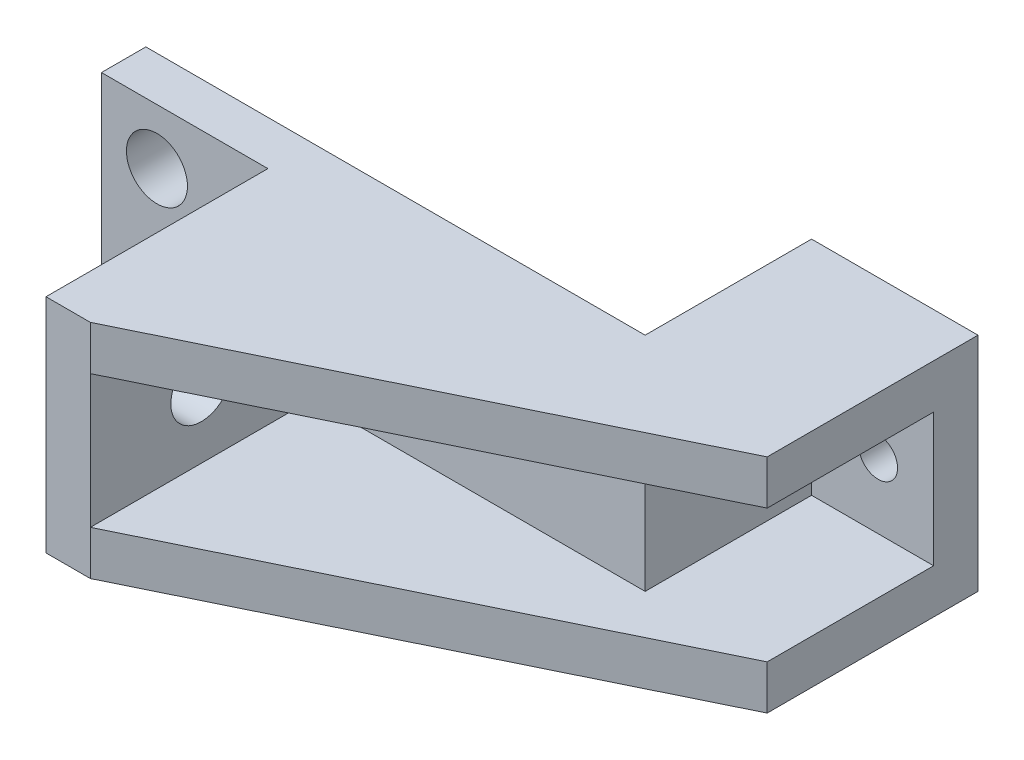
ISO-10303-21;
HEADER;
FILE_DESCRIPTION(('STEP AP214'),'2;1');
FILE_NAME('part.step','',(''),(''),'','','');
FILE_SCHEMA(('AUTOMOTIVE_DESIGN { 1 0 10303 214 1 1 1 1 }'));
ENDSEC;
DATA;
#1=APPLICATION_CONTEXT('core data for automotive mechanical design processes');
#2=APPLICATION_PROTOCOL_DEFINITION('international standard','automotive_design',2000,#1);
#3=PRODUCT_CONTEXT('',#1,'mechanical');
#4=PRODUCT('Part','Part','',(#3));
#5=PRODUCT_RELATED_PRODUCT_CATEGORY('part','',(#4));
#6=PRODUCT_DEFINITION_FORMATION('','',#4);
#7=PRODUCT_DEFINITION_CONTEXT('part definition',#1,'design');
#8=PRODUCT_DEFINITION('design','',#6,#7);
#9=PRODUCT_DEFINITION_SHAPE('','',#8);
#10=(LENGTH_UNIT() NAMED_UNIT(*) SI_UNIT(.MILLI.,.METRE.));
#11=(NAMED_UNIT(*) PLANE_ANGLE_UNIT() SI_UNIT($,.RADIAN.));
#12=(NAMED_UNIT(*) SI_UNIT($,.STERADIAN.) SOLID_ANGLE_UNIT());
#13=UNCERTAINTY_MEASURE_WITH_UNIT(LENGTH_MEASURE(1.E-05),#10,'distance_accuracy_value','');
#14=(GEOMETRIC_REPRESENTATION_CONTEXT(3) GLOBAL_UNCERTAINTY_ASSIGNED_CONTEXT((#13)) GLOBAL_UNIT_ASSIGNED_CONTEXT((#10,
#11,#12)) REPRESENTATION_CONTEXT('',''));
#15=CARTESIAN_POINT('',(0.,0.,0.));
#16=DIRECTION('',(0.,0.,1.));
#17=DIRECTION('',(1.,0.,0.));
#18=AXIS2_PLACEMENT_3D('',#15,#16,#17);
#19=CARTESIAN_POINT('',(0.,-16.,0.));
#20=DIRECTION('',(0.,-1.,0.));
#21=DIRECTION('',(0.,0.,-1.));
#22=AXIS2_PLACEMENT_3D('',#19,#20,#21);
#23=PLANE('',#22);
#24=DIRECTION('',(0.,0.,-1.));
#25=VECTOR('',#24,1.);
#26=CARTESIAN_POINT('',(49.,-16.,4.));
#27=LINE('',#26,#25);
#28=CARTESIAN_POINT('',(49.,-16.,4.));
#29=VERTEX_POINT('',#28);
#30=CARTESIAN_POINT('',(49.,-16.,-11.));
#31=VERTEX_POINT('',#30);
#32=EDGE_CURVE('E161',#29,#31,#27,.T.);
#33=ORIENTED_EDGE('',*,*,#32,.F.);
#34=DIRECTION('',(-1.,0.,0.));
#35=VECTOR('',#34,1.);
#36=CARTESIAN_POINT('',(0.,-16.,4.));
#37=LINE('',#36,#35);
#38=CARTESIAN_POINT('',(19.,-16.,4.));
#39=VERTEX_POINT('',#38);
#40=EDGE_CURVE('E146',#29,#39,#37,.T.);
#41=ORIENTED_EDGE('',*,*,#40,.T.);
#42=DIRECTION('',(0.,0.,1.));
#43=VECTOR('',#42,1.);
#44=CARTESIAN_POINT('',(19.,-16.,0.));
#45=LINE('',#44,#43);
#46=CARTESIAN_POINT('',(19.,-16.,24.));
#47=VERTEX_POINT('',#46);
#48=EDGE_CURVE('E156',#39,#47,#45,.T.);
#49=ORIENTED_EDGE('',*,*,#48,.T.);
#50=DIRECTION('',(0.8987684456439,0.,-0.438423632021414));
#51=VECTOR('',#50,1.);
#52=CARTESIAN_POINT('',(13.1090821720327,-16.,26.873618452667));
#53=LINE('',#52,#51);
#54=CARTESIAN_POINT('',(60.,-16.,4.));
#55=VERTEX_POINT('',#54);
#56=EDGE_CURVE('E223',#47,#55,#53,.T.);
#57=ORIENTED_EDGE('',*,*,#56,.T.);
#58=DIRECTION('',(0.,0.,1.));
#59=VECTOR('',#58,1.);
#60=CARTESIAN_POINT('',(60.,-16.,-11.));
#61=LINE('',#60,#59);
#62=CARTESIAN_POINT('',(60.,-16.,-11.));
#63=VERTEX_POINT('',#62);
#64=EDGE_CURVE('E194',#63,#55,#61,.T.);
#65=ORIENTED_EDGE('',*,*,#64,.F.);
#66=DIRECTION('',(1.,0.,0.));
#67=VECTOR('',#66,1.);
#68=CARTESIAN_POINT('',(60.,-16.,-11.));
#69=LINE('',#68,#67);
#70=EDGE_CURVE('E168',#31,#63,#69,.T.);
#71=ORIENTED_EDGE('',*,*,#70,.F.);
#72=EDGE_LOOP('',(#33,#41,#49,#57,#65,#71));
#73=FACE_BOUND('',#72,.T.);
#74=ADVANCED_FACE('F38',(#73),#23,.F.);
#75=CARTESIAN_POINT('',(0.,-4.,0.));
#76=DIRECTION('',(0.,-1.,0.));
#77=DIRECTION('',(0.,0.,-1.));
#78=AXIS2_PLACEMENT_3D('',#75,#76,#77);
#79=PLANE('',#78);
#80=DIRECTION('',(-1.,0.,0.));
#81=VECTOR('',#80,1.);
#82=CARTESIAN_POINT('',(60.,-4.,4.));
#83=LINE('',#82,#81);
#84=CARTESIAN_POINT('',(49.,-4.,4.));
#85=VERTEX_POINT('',#84);
#86=CARTESIAN_POINT('',(19.,-4.,4.));
#87=VERTEX_POINT('',#86);
#88=EDGE_CURVE('E55',#85,#87,#83,.T.);
#89=ORIENTED_EDGE('',*,*,#88,.F.);
#90=DIRECTION('',(0.,0.,1.));
#91=VECTOR('',#90,1.);
#92=CARTESIAN_POINT('',(49.,-4.,4.));
#93=LINE('',#92,#91);
#94=CARTESIAN_POINT('',(49.,-4.,-11.));
#95=VERTEX_POINT('',#94);
#96=EDGE_CURVE('E164',#95,#85,#93,.T.);
#97=ORIENTED_EDGE('',*,*,#96,.F.);
#98=DIRECTION('',(-1.,0.,0.));
#99=VECTOR('',#98,1.);
#100=CARTESIAN_POINT('',(60.,-4.,-11.));
#101=LINE('',#100,#99);
#102=CARTESIAN_POINT('',(60.,-4.,-11.));
#103=VERTEX_POINT('',#102);
#104=EDGE_CURVE('E190',#103,#95,#101,.T.);
#105=ORIENTED_EDGE('',*,*,#104,.F.);
#106=DIRECTION('',(0.,0.,1.));
#107=VECTOR('',#106,1.);
#108=CARTESIAN_POINT('',(60.,-4.,-11.));
#109=LINE('',#108,#107);
#110=CARTESIAN_POINT('',(60.,-4.,4.));
#111=VERTEX_POINT('',#110);
#112=EDGE_CURVE('E63',#103,#111,#109,.T.);
#113=ORIENTED_EDGE('',*,*,#112,.T.);
#114=DIRECTION('',(0.8987684456439,0.,-0.438423632021414));
#115=VECTOR('',#114,1.);
#116=CARTESIAN_POINT('',(19.,-4.,24.));
#117=LINE('',#116,#115);
#118=CARTESIAN_POINT('',(19.,-4.,24.));
#119=VERTEX_POINT('',#118);
#120=EDGE_CURVE('E213',#119,#111,#117,.T.);
#121=ORIENTED_EDGE('',*,*,#120,.F.);
#122=DIRECTION('',(0.,0.,1.));
#123=VECTOR('',#122,1.);
#124=CARTESIAN_POINT('',(19.,-4.,4.));
#125=LINE('',#124,#123);
#126=EDGE_CURVE('E210',#87,#119,#125,.T.);
#127=ORIENTED_EDGE('',*,*,#126,.F.);
#128=EDGE_LOOP('',(#89,#97,#105,#113,#121,#127));
#129=FACE_BOUND('',#128,.T.);
#130=ADVANCED_FACE('F297',(#129),#79,.T.);
#131=CARTESIAN_POINT('',(0.,0.,-11.));
#132=DIRECTION('',(0.,0.,1.));
#133=DIRECTION('',(1.,0.,0.));
#134=AXIS2_PLACEMENT_3D('',#131,#132,#133);
#135=PLANE('',#134);
#136=CARTESIAN_POINT('',(55.,-10.,-11.));
#137=DIRECTION('',(0.,0.,1.));
#138=DIRECTION('',(1.,0.,0.));
#139=AXIS2_PLACEMENT_3D('',#136,#137,#138);
#140=CIRCLE('',#139,1.75);
#141=CARTESIAN_POINT('',(56.75,-10.,-11.));
#142=VERTEX_POINT('',#141);
#143=EDGE_CURVE('E196',#142,#142,#140,.T.);
#144=ORIENTED_EDGE('',*,*,#143,.F.);
#145=EDGE_LOOP('',(#144));
#146=FACE_BOUND('',#145,.T.);
#147=ORIENTED_EDGE('',*,*,#104,.T.);
#148=DIRECTION('',(0.,1.,0.));
#149=VECTOR('',#148,1.);
#150=CARTESIAN_POINT('',(49.,-16.,-11.));
#151=LINE('',#150,#149);
#152=EDGE_CURVE('E169',#31,#95,#151,.T.);
#153=ORIENTED_EDGE('',*,*,#152,.F.);
#154=ORIENTED_EDGE('',*,*,#70,.T.);
#155=DIRECTION('',(0.,1.,0.));
#156=VECTOR('',#155,1.);
#157=CARTESIAN_POINT('',(60.,-16.,-11.));
#158=LINE('',#157,#156);
#159=EDGE_CURVE('E187',#63,#103,#158,.T.);
#160=ORIENTED_EDGE('',*,*,#159,.T.);
#161=EDGE_LOOP('',(#147,#153,#154,#160));
#162=FACE_BOUND('',#161,.T.);
#163=ADVANCED_FACE('F294',(#146,#162),#135,.T.);
#164=CARTESIAN_POINT('',(55.,-10.,4.));
#165=DIRECTION('',(0.,0.,-1.));
#166=DIRECTION('',(-1.,0.,0.));
#167=AXIS2_PLACEMENT_3D('',#164,#165,#166);
#168=CYLINDRICAL_SURFACE('',#167,1.75);
#169=CARTESIAN_POINT('',(55.,-10.,-15.));
#170=DIRECTION('',(0.,0.,-1.));
#171=DIRECTION('',(-1.,0.,0.));
#172=AXIS2_PLACEMENT_3D('',#169,#170,#171);
#173=CIRCLE('',#172,1.75);
#174=CARTESIAN_POINT('',(53.25,-10.,-15.));
#175=VERTEX_POINT('',#174);
#176=EDGE_CURVE('E198',#175,#175,#173,.T.);
#177=ORIENTED_EDGE('',*,*,#176,.T.);
#178=EDGE_LOOP('',(#177));
#179=FACE_BOUND('',#178,.T.);
#180=ORIENTED_EDGE('',*,*,#143,.T.);
#181=EDGE_LOOP('',(#180));
#182=FACE_BOUND('',#181,.T.);
#183=ADVANCED_FACE('F292',(#179,#182),#168,.F.);
#184=CARTESIAN_POINT('',(0.,0.,0.));
#185=DIRECTION('',(0.,0.,1.));
#186=DIRECTION('',(1.,0.,0.));
#187=AXIS2_PLACEMENT_3D('',#184,#185,#186);
#188=PLANE('',#187);
#189=CARTESIAN_POINT('',(5.,-5.,0.));
#190=DIRECTION('',(0.,0.,1.));
#191=DIRECTION('',(1.,0.,0.));
#192=AXIS2_PLACEMENT_3D('',#189,#190,#191);
#193=CIRCLE('',#192,2.75);
#194=CARTESIAN_POINT('',(7.75,-5.,0.));
#195=VERTEX_POINT('',#194);
#196=EDGE_CURVE('E258',#195,#195,#193,.T.);
#197=ORIENTED_EDGE('',*,*,#196,.T.);
#198=EDGE_LOOP('',(#197));
#199=FACE_BOUND('',#198,.T.);
#200=CARTESIAN_POINT('',(5.,-15.,0.));
#201=DIRECTION('',(0.,0.,1.));
#202=DIRECTION('',(1.,0.,0.));
#203=AXIS2_PLACEMENT_3D('',#200,#201,#202);
#204=CIRCLE('',#203,2.75);
#205=CARTESIAN_POINT('',(7.75,-15.,0.));
#206=VERTEX_POINT('',#205);
#207=EDGE_CURVE('E254',#206,#206,#204,.T.);
#208=ORIENTED_EDGE('',*,*,#207,.T.);
#209=EDGE_LOOP('',(#208));
#210=FACE_BOUND('',#209,.T.);
#211=DIRECTION('',(-1.,0.,0.));
#212=VECTOR('',#211,1.);
#213=CARTESIAN_POINT('',(0.,0.,0.));
#214=LINE('',#213,#212);
#215=CARTESIAN_POINT('',(45.,0.,0.));
#216=VERTEX_POINT('',#215);
#217=CARTESIAN_POINT('',(0.,0.,0.));
#218=VERTEX_POINT('',#217);
#219=EDGE_CURVE('E271',#216,#218,#214,.T.);
#220=ORIENTED_EDGE('',*,*,#219,.F.);
#221=DIRECTION('',(0.,-1.,0.));
#222=VECTOR('',#221,1.);
#223=CARTESIAN_POINT('',(45.,-20.,0.));
#224=LINE('',#223,#222);
#225=CARTESIAN_POINT('',(45.,-20.,0.));
#226=VERTEX_POINT('',#225);
#227=EDGE_CURVE('E177',#216,#226,#224,.T.);
#228=ORIENTED_EDGE('',*,*,#227,.T.);
#229=DIRECTION('',(1.,0.,0.));
#230=VECTOR('',#229,1.);
#231=CARTESIAN_POINT('',(0.,-20.,0.));
#232=LINE('',#231,#230);
#233=CARTESIAN_POINT('',(0.,-20.,0.));
#234=VERTEX_POINT('',#233);
#235=EDGE_CURVE('E281',#234,#226,#232,.T.);
#236=ORIENTED_EDGE('',*,*,#235,.F.);
#237=DIRECTION('',(0.,-1.,0.));
#238=VECTOR('',#237,1.);
#239=CARTESIAN_POINT('',(0.,0.,0.));
#240=LINE('',#239,#238);
#241=EDGE_CURVE('E264',#218,#234,#240,.T.);
#242=ORIENTED_EDGE('',*,*,#241,.F.);
#243=EDGE_LOOP('',(#220,#228,#236,#242));
#244=FACE_BOUND('',#243,.T.);
#245=ADVANCED_FACE('F341',(#199,#210,#244),#188,.F.);
#246=CARTESIAN_POINT('',(0.,0.,4.));
#247=DIRECTION('',(0.,0.,1.));
#248=DIRECTION('',(1.,0.,0.));
#249=AXIS2_PLACEMENT_3D('',#246,#247,#248);
#250=PLANE('',#249);
#251=ORIENTED_EDGE('',*,*,#40,.F.);
#252=DIRECTION('',(0.,-1.,0.));
#253=VECTOR('',#252,1.);
#254=CARTESIAN_POINT('',(49.,-16.,4.));
#255=LINE('',#254,#253);
#256=EDGE_CURVE('E149',#85,#29,#255,.T.);
#257=ORIENTED_EDGE('',*,*,#256,.F.);
#258=ORIENTED_EDGE('',*,*,#88,.T.);
#259=DIRECTION('',(0.,1.,0.));
#260=VECTOR('',#259,1.);
#261=CARTESIAN_POINT('',(19.,0.,4.));
#262=LINE('',#261,#260);
#263=EDGE_CURVE('E150',#39,#87,#262,.T.);
#264=ORIENTED_EDGE('',*,*,#263,.F.);
#265=EDGE_LOOP('',(#251,#257,#258,#264));
#266=FACE_BOUND('',#265,.T.);
#267=ADVANCED_FACE('F148',(#266),#250,.T.);
#268=CARTESIAN_POINT('',(19.,0.,24.));
#269=DIRECTION('',(1.,0.,0.));
#270=DIRECTION('',(0.,1.,0.));
#271=AXIS2_PLACEMENT_3D('',#268,#269,#270);
#272=PLANE('',#271);
#273=CARTESIAN_POINT('',(19.,-10.,14.));
#274=DIRECTION('',(1.,0.,0.));
#275=DIRECTION('',(0.,1.,0.));
#276=AXIS2_PLACEMENT_3D('',#273,#274,#275);
#277=CIRCLE('',#276,2.75);
#278=CARTESIAN_POINT('',(19.,-7.25,14.));
#279=VERTEX_POINT('',#278);
#280=EDGE_CURVE('E183',#279,#279,#277,.T.);
#281=ORIENTED_EDGE('',*,*,#280,.F.);
#282=EDGE_LOOP('',(#281));
#283=FACE_BOUND('',#282,.T.);
#284=ORIENTED_EDGE('',*,*,#126,.T.);
#285=DIRECTION('',(0.,-1.,0.));
#286=VECTOR('',#285,1.);
#287=CARTESIAN_POINT('',(19.,0.,24.));
#288=LINE('',#287,#286);
#289=EDGE_CURVE('E237',#119,#47,#288,.T.);
#290=ORIENTED_EDGE('',*,*,#289,.T.);
#291=ORIENTED_EDGE('',*,*,#48,.F.);
#292=ORIENTED_EDGE('',*,*,#263,.T.);
#293=EDGE_LOOP('',(#284,#290,#291,#292));
#294=FACE_BOUND('',#293,.T.);
#295=ADVANCED_FACE('F302',(#283,#294),#272,.T.);
#296=DIRECTION('',(0.,-1.,0.));
#297=VECTOR('',#296,1.);
#298=CARTESIAN_POINT('',(15.,0.,4.));
#299=LINE('',#298,#297);
#300=CARTESIAN_POINT('',(15.,0.,4.));
#301=VERTEX_POINT('',#300);
#302=CARTESIAN_POINT('',(15.,-20.,4.));
#303=VERTEX_POINT('',#302);
#304=EDGE_CURVE('E251',#301,#303,#299,.T.);
#305=ORIENTED_EDGE('',*,*,#304,.F.);
#306=DIRECTION('',(-1.,0.,0.));
#307=VECTOR('',#306,1.);
#308=CARTESIAN_POINT('',(0.,0.,4.));
#309=LINE('',#308,#307);
#310=CARTESIAN_POINT('',(0.,0.,4.));
#311=VERTEX_POINT('',#310);
#312=EDGE_CURVE('E276',#301,#311,#309,.T.);
#313=ORIENTED_EDGE('',*,*,#312,.T.);
#314=DIRECTION('',(0.,-1.,0.));
#315=VECTOR('',#314,1.);
#316=CARTESIAN_POINT('',(0.,0.,4.));
#317=LINE('',#316,#315);
#318=CARTESIAN_POINT('',(0.,-20.,4.));
#319=VERTEX_POINT('',#318);
#320=EDGE_CURVE('E267',#311,#319,#317,.T.);
#321=ORIENTED_EDGE('',*,*,#320,.T.);
#322=DIRECTION('',(1.,0.,0.));
#323=VECTOR('',#322,1.);
#324=CARTESIAN_POINT('',(0.,-20.,4.));
#325=LINE('',#324,#323);
#326=EDGE_CURVE('E270',#319,#303,#325,.T.);
#327=ORIENTED_EDGE('',*,*,#326,.T.);
#328=EDGE_LOOP('',(#305,#313,#321,#327));
#329=FACE_BOUND('',#328,.T.);
#330=CARTESIAN_POINT('',(5.,-5.,4.));
#331=DIRECTION('',(0.,0.,1.));
#332=DIRECTION('',(1.,0.,0.));
#333=AXIS2_PLACEMENT_3D('',#330,#331,#332);
#334=CIRCLE('',#333,2.75);
#335=CARTESIAN_POINT('',(7.75,-5.,4.));
#336=VERTEX_POINT('',#335);
#337=EDGE_CURVE('E261',#336,#336,#334,.T.);
#338=ORIENTED_EDGE('',*,*,#337,.F.);
#339=EDGE_LOOP('',(#338));
#340=FACE_BOUND('',#339,.T.);
#341=CARTESIAN_POINT('',(5.,-15.,4.));
#342=DIRECTION('',(0.,0.,1.));
#343=DIRECTION('',(1.,0.,0.));
#344=AXIS2_PLACEMENT_3D('',#341,#342,#343);
#345=CIRCLE('',#344,2.75);
#346=CARTESIAN_POINT('',(7.75,-15.,4.));
#347=VERTEX_POINT('',#346);
#348=EDGE_CURVE('E255',#347,#347,#345,.T.);
#349=ORIENTED_EDGE('',*,*,#348,.F.);
#350=EDGE_LOOP('',(#349));
#351=FACE_BOUND('',#350,.T.);
#352=ADVANCED_FACE('F345',(#329,#340,#351),#250,.T.);
#353=CARTESIAN_POINT('',(0.,0.,4.));
#354=DIRECTION('',(1.,0.,0.));
#355=DIRECTION('',(0.,1.,0.));
#356=AXIS2_PLACEMENT_3D('',#353,#354,#355);
#357=PLANE('',#356);
#358=ORIENTED_EDGE('',*,*,#241,.T.);
#359=DIRECTION('',(0.,0.,-1.));
#360=VECTOR('',#359,1.);
#361=CARTESIAN_POINT('',(0.,-20.,4.));
#362=LINE('',#361,#360);
#363=EDGE_CURVE('E12',#319,#234,#362,.T.);
#364=ORIENTED_EDGE('',*,*,#363,.F.);
#365=ORIENTED_EDGE('',*,*,#320,.F.);
#366=DIRECTION('',(0.,0.,-1.));
#367=VECTOR('',#366,1.);
#368=CARTESIAN_POINT('',(0.,0.,4.));
#369=LINE('',#368,#367);
#370=EDGE_CURVE('E278',#311,#218,#369,.T.);
#371=ORIENTED_EDGE('',*,*,#370,.T.);
#372=EDGE_LOOP('',(#358,#364,#365,#371));
#373=FACE_BOUND('',#372,.T.);
#374=ADVANCED_FACE('F40',(#373),#357,.F.);
#375=CARTESIAN_POINT('',(0.,-20.,4.));
#376=DIRECTION('',(0.,1.,0.));
#377=DIRECTION('',(0.,0.,1.));
#378=AXIS2_PLACEMENT_3D('',#375,#376,#377);
#379=PLANE('',#378);
#380=ORIENTED_EDGE('',*,*,#235,.T.);
#381=DIRECTION('',(0.,0.,-1.));
#382=VECTOR('',#381,1.);
#383=CARTESIAN_POINT('',(45.,-20.,36.0555127546399));
#384=LINE('',#383,#382);
#385=CARTESIAN_POINT('',(45.,-20.,-15.));
#386=VERTEX_POINT('',#385);
#387=EDGE_CURVE('E180',#226,#386,#384,.T.);
#388=ORIENTED_EDGE('',*,*,#387,.T.);
#389=DIRECTION('',(-1.,0.,0.));
#390=VECTOR('',#389,1.);
#391=CARTESIAN_POINT('',(60.,-20.,-15.));
#392=LINE('',#391,#390);
#393=CARTESIAN_POINT('',(60.,-20.,-15.));
#394=VERTEX_POINT('',#393);
#395=EDGE_CURVE('E204',#394,#386,#392,.T.);
#396=ORIENTED_EDGE('',*,*,#395,.F.);
#397=DIRECTION('',(0.,0.,-1.));
#398=VECTOR('',#397,1.);
#399=CARTESIAN_POINT('',(60.,-20.,4.));
#400=LINE('',#399,#398);
#401=CARTESIAN_POINT('',(60.,-20.,4.));
#402=VERTEX_POINT('',#401);
#403=EDGE_CURVE('E47',#402,#394,#400,.T.);
#404=ORIENTED_EDGE('',*,*,#403,.F.);
#405=DIRECTION('',(0.8987684456439,0.,-0.438423632021414));
#406=VECTOR('',#405,1.);
#407=CARTESIAN_POINT('',(13.1090821720327,-20.,26.873618452667));
#408=LINE('',#407,#406);
#409=CARTESIAN_POINT('',(19.,-20.,24.));
#410=VERTEX_POINT('',#409);
#411=EDGE_CURVE('E222',#410,#402,#408,.T.);
#412=ORIENTED_EDGE('',*,*,#411,.F.);
#413=DIRECTION('',(-1.,0.,0.));
#414=VECTOR('',#413,1.);
#415=CARTESIAN_POINT('',(15.,-20.,24.));
#416=LINE('',#415,#414);
#417=CARTESIAN_POINT('',(15.,-20.,24.));
#418=VERTEX_POINT('',#417);
#419=EDGE_CURVE('E241',#410,#418,#416,.T.);
#420=ORIENTED_EDGE('',*,*,#419,.T.);
#421=DIRECTION('',(0.,0.,-1.));
#422=VECTOR('',#421,1.);
#423=CARTESIAN_POINT('',(15.,-20.,24.));
#424=LINE('',#423,#422);
#425=EDGE_CURVE('E245',#418,#303,#424,.T.);
#426=ORIENTED_EDGE('',*,*,#425,.T.);
#427=ORIENTED_EDGE('',*,*,#326,.F.);
#428=ORIENTED_EDGE('',*,*,#363,.T.);
#429=EDGE_LOOP('',(#380,#388,#396,#404,#412,#420,#426,#427,#428));
#430=FACE_BOUND('',#429,.T.);
#431=ADVANCED_FACE('F320',(#430),#379,.F.);
#432=CARTESIAN_POINT('',(60.,0.,4.));
#433=DIRECTION('',(-1.,0.,0.));
#434=DIRECTION('',(0.,0.,1.));
#435=AXIS2_PLACEMENT_3D('',#432,#433,#434);
#436=PLANE('',#435);
#437=ORIENTED_EDGE('',*,*,#159,.F.);
#438=ORIENTED_EDGE('',*,*,#64,.T.);
#439=DIRECTION('',(0.,1.,0.));
#440=VECTOR('',#439,1.);
#441=CARTESIAN_POINT('',(60.,0.,4.));
#442=LINE('',#441,#440);
#443=EDGE_CURVE('E273',#402,#55,#442,.T.);
#444=ORIENTED_EDGE('',*,*,#443,.F.);
#445=ORIENTED_EDGE('',*,*,#403,.T.);
#446=DIRECTION('',(0.,-1.,0.));
#447=VECTOR('',#446,1.);
#448=CARTESIAN_POINT('',(60.,-20.,-15.));
#449=LINE('',#448,#447);
#450=CARTESIAN_POINT('',(60.,0.,-15.));
#451=VERTEX_POINT('',#450);
#452=EDGE_CURVE('E201',#451,#394,#449,.T.);
#453=ORIENTED_EDGE('',*,*,#452,.F.);
#454=DIRECTION('',(0.,0.,-1.));
#455=VECTOR('',#454,1.);
#456=CARTESIAN_POINT('',(60.,0.,4.));
#457=LINE('',#456,#455);
#458=CARTESIAN_POINT('',(60.,0.,4.));
#459=VERTEX_POINT('',#458);
#460=EDGE_CURVE('E286',#459,#451,#457,.T.);
#461=ORIENTED_EDGE('',*,*,#460,.F.);
#462=DIRECTION('',(0.,1.,0.));
#463=VECTOR('',#462,1.);
#464=CARTESIAN_POINT('',(60.,-4.,4.));
#465=LINE('',#464,#463);
#466=EDGE_CURVE('E217',#111,#459,#465,.T.);
#467=ORIENTED_EDGE('',*,*,#466,.F.);
#468=ORIENTED_EDGE('',*,*,#112,.F.);
#469=EDGE_LOOP('',(#437,#438,#444,#445,#453,#461,#467,#468));
#470=FACE_BOUND('',#469,.T.);
#471=ADVANCED_FACE('F327',(#470),#436,.F.);
#472=CARTESIAN_POINT('',(0.,0.,4.));
#473=DIRECTION('',(0.,-1.,0.));
#474=DIRECTION('',(0.,0.,-1.));
#475=AXIS2_PLACEMENT_3D('',#472,#473,#474);
#476=PLANE('',#475);
#477=DIRECTION('',(0.,0.,-1.));
#478=VECTOR('',#477,1.);
#479=CARTESIAN_POINT('',(45.,0.,36.0555127546399));
#480=LINE('',#479,#478);
#481=CARTESIAN_POINT('',(45.,0.,-15.));
#482=VERTEX_POINT('',#481);
#483=EDGE_CURVE('E176',#216,#482,#480,.T.);
#484=ORIENTED_EDGE('',*,*,#483,.F.);
#485=ORIENTED_EDGE('',*,*,#219,.T.);
#486=ORIENTED_EDGE('',*,*,#370,.F.);
#487=ORIENTED_EDGE('',*,*,#312,.F.);
#488=DIRECTION('',(0.,0.,-1.));
#489=VECTOR('',#488,1.);
#490=CARTESIAN_POINT('',(15.,0.,24.));
#491=LINE('',#490,#489);
#492=CARTESIAN_POINT('',(15.,0.,24.));
#493=VERTEX_POINT('',#492);
#494=EDGE_CURVE('E244',#493,#301,#491,.T.);
#495=ORIENTED_EDGE('',*,*,#494,.F.);
#496=DIRECTION('',(1.,0.,0.));
#497=VECTOR('',#496,1.);
#498=CARTESIAN_POINT('',(15.,0.,24.));
#499=LINE('',#498,#497);
#500=CARTESIAN_POINT('',(19.,0.,24.));
#501=VERTEX_POINT('',#500);
#502=EDGE_CURVE('E234',#493,#501,#499,.T.);
#503=ORIENTED_EDGE('',*,*,#502,.T.);
#504=DIRECTION('',(0.8987684456439,0.,-0.438423632021414));
#505=VECTOR('',#504,1.);
#506=CARTESIAN_POINT('',(19.,0.,24.));
#507=LINE('',#506,#505);
#508=EDGE_CURVE('E209',#501,#459,#507,.T.);
#509=ORIENTED_EDGE('',*,*,#508,.T.);
#510=ORIENTED_EDGE('',*,*,#460,.T.);
#511=DIRECTION('',(1.,0.,0.));
#512=VECTOR('',#511,1.);
#513=CARTESIAN_POINT('',(60.,0.,-15.));
#514=LINE('',#513,#512);
#515=EDGE_CURVE('E207',#482,#451,#514,.T.);
#516=ORIENTED_EDGE('',*,*,#515,.F.);
#517=EDGE_LOOP('',(#484,#485,#486,#487,#495,#503,#509,#510,#516));
#518=FACE_BOUND('',#517,.T.);
#519=ADVANCED_FACE('F313',(#518),#476,.F.);
#520=CARTESIAN_POINT('',(5.,-5.,4.));
#521=DIRECTION('',(0.,0.,-1.));
#522=DIRECTION('',(-1.,0.,0.));
#523=AXIS2_PLACEMENT_3D('',#520,#521,#522);
#524=CYLINDRICAL_SURFACE('',#523,2.75);
#525=ORIENTED_EDGE('',*,*,#337,.T.);
#526=EDGE_LOOP('',(#525));
#527=FACE_BOUND('',#526,.T.);
#528=ORIENTED_EDGE('',*,*,#196,.F.);
#529=EDGE_LOOP('',(#528));
#530=FACE_BOUND('',#529,.T.);
#531=ADVANCED_FACE('F356',(#527,#530),#524,.F.);
#532=CARTESIAN_POINT('',(5.,-15.,4.));
#533=DIRECTION('',(0.,0.,-1.));
#534=DIRECTION('',(-1.,0.,0.));
#535=AXIS2_PLACEMENT_3D('',#532,#533,#534);
#536=CYLINDRICAL_SURFACE('',#535,2.75);
#537=ORIENTED_EDGE('',*,*,#348,.T.);
#538=EDGE_LOOP('',(#537));
#539=FACE_BOUND('',#538,.T.);
#540=ORIENTED_EDGE('',*,*,#207,.F.);
#541=EDGE_LOOP('',(#540));
#542=FACE_BOUND('',#541,.T.);
#543=ADVANCED_FACE('F353',(#539,#542),#536,.F.);
#544=CARTESIAN_POINT('',(15.,0.,24.));
#545=DIRECTION('',(-1.,0.,0.));
#546=DIRECTION('',(0.,0.,1.));
#547=AXIS2_PLACEMENT_3D('',#544,#545,#546);
#548=PLANE('',#547);
#549=CARTESIAN_POINT('',(15.,-10.,14.));
#550=DIRECTION('',(-1.,0.,0.));
#551=DIRECTION('',(0.,0.,1.));
#552=AXIS2_PLACEMENT_3D('',#549,#550,#551);
#553=CIRCLE('',#552,2.75);
#554=CARTESIAN_POINT('',(15.,-10.,16.75));
#555=VERTEX_POINT('',#554);
#556=EDGE_CURVE('E42',#555,#555,#553,.T.);
#557=ORIENTED_EDGE('',*,*,#556,.F.);
#558=EDGE_LOOP('',(#557));
#559=FACE_BOUND('',#558,.T.);
#560=ORIENTED_EDGE('',*,*,#494,.T.);
#561=ORIENTED_EDGE('',*,*,#304,.T.);
#562=ORIENTED_EDGE('',*,*,#425,.F.);
#563=DIRECTION('',(0.,1.,0.));
#564=VECTOR('',#563,1.);
#565=CARTESIAN_POINT('',(15.,0.,24.));
#566=LINE('',#565,#564);
#567=EDGE_CURVE('E231',#418,#493,#566,.T.);
#568=ORIENTED_EDGE('',*,*,#567,.T.);
#569=EDGE_LOOP('',(#560,#561,#562,#568));
#570=FACE_BOUND('',#569,.T.);
#571=ADVANCED_FACE('F317',(#559,#570),#548,.T.);
#572=CARTESIAN_POINT('',(0.,0.,24.));
#573=DIRECTION('',(0.,0.,1.));
#574=DIRECTION('',(1.,0.,0.));
#575=AXIS2_PLACEMENT_3D('',#572,#573,#574);
#576=PLANE('',#575);
#577=ORIENTED_EDGE('',*,*,#567,.F.);
#578=ORIENTED_EDGE('',*,*,#419,.F.);
#579=DIRECTION('',(0.,-1.,0.));
#580=VECTOR('',#579,1.);
#581=CARTESIAN_POINT('',(19.,-16.,24.));
#582=LINE('',#581,#580);
#583=EDGE_CURVE('E155',#47,#410,#582,.T.);
#584=ORIENTED_EDGE('',*,*,#583,.F.);
#585=ORIENTED_EDGE('',*,*,#289,.F.);
#586=EDGE_CURVE('E238',#501,#119,#288,.T.);
#587=ORIENTED_EDGE('',*,*,#586,.F.);
#588=ORIENTED_EDGE('',*,*,#502,.F.);
#589=EDGE_LOOP('',(#577,#578,#584,#585,#587,#588));
#590=FACE_BOUND('',#589,.T.);
#591=ADVANCED_FACE('F310',(#590),#576,.T.);
#592=CARTESIAN_POINT('',(13.1090821720327,-16.,26.873618452667));
#593=DIRECTION('',(-0.438423632021414,0.,-0.8987684456439));
#594=DIRECTION('',(-0.8987684456439,0.,0.438423632021414));
#595=AXIS2_PLACEMENT_3D('',#592,#593,#594);
#596=PLANE('',#595);
#597=ORIENTED_EDGE('',*,*,#411,.T.);
#598=ORIENTED_EDGE('',*,*,#443,.T.);
#599=ORIENTED_EDGE('',*,*,#56,.F.);
#600=ORIENTED_EDGE('',*,*,#583,.T.);
#601=EDGE_LOOP('',(#597,#598,#599,#600));
#602=FACE_BOUND('',#601,.T.);
#603=ADVANCED_FACE('F324',(#602),#596,.F.);
#604=CARTESIAN_POINT('',(19.,-4.,24.));
#605=DIRECTION('',(0.438423632021414,0.,0.8987684456439));
#606=DIRECTION('',(0.8987684456439,0.,-0.438423632021415));
#607=AXIS2_PLACEMENT_3D('',#604,#605,#606);
#608=PLANE('',#607);
#609=ORIENTED_EDGE('',*,*,#508,.F.);
#610=ORIENTED_EDGE('',*,*,#586,.T.);
#611=ORIENTED_EDGE('',*,*,#120,.T.);
#612=ORIENTED_EDGE('',*,*,#466,.T.);
#613=EDGE_LOOP('',(#609,#610,#611,#612));
#614=FACE_BOUND('',#613,.T.);
#615=ADVANCED_FACE('F306',(#614),#608,.T.);
#616=CARTESIAN_POINT('',(0.,0.,-15.));
#617=DIRECTION('',(0.,0.,1.));
#618=DIRECTION('',(1.,0.,0.));
#619=AXIS2_PLACEMENT_3D('',#616,#617,#618);
#620=PLANE('',#619);
#621=ORIENTED_EDGE('',*,*,#395,.T.);
#622=DIRECTION('',(0.,-1.,0.));
#623=VECTOR('',#622,1.);
#624=CARTESIAN_POINT('',(45.,-20.,-15.));
#625=LINE('',#624,#623);
#626=EDGE_CURVE('E174',#482,#386,#625,.T.);
#627=ORIENTED_EDGE('',*,*,#626,.F.);
#628=ORIENTED_EDGE('',*,*,#515,.T.);
#629=ORIENTED_EDGE('',*,*,#452,.T.);
#630=EDGE_LOOP('',(#621,#627,#628,#629));
#631=FACE_BOUND('',#630,.T.);
#632=ORIENTED_EDGE('',*,*,#176,.F.);
#633=EDGE_LOOP('',(#632));
#634=FACE_BOUND('',#633,.T.);
#635=ADVANCED_FACE('F332',(#631,#634),#620,.F.);
#636=CARTESIAN_POINT('',(4.,-10.,14.));
#637=DIRECTION('',(1.,0.,0.));
#638=DIRECTION('',(0.,1.,0.));
#639=AXIS2_PLACEMENT_3D('',#636,#637,#638);
#640=CYLINDRICAL_SURFACE('',#639,2.75);
#641=ORIENTED_EDGE('',*,*,#556,.T.);
#642=EDGE_LOOP('',(#641));
#643=FACE_BOUND('',#642,.T.);
#644=ORIENTED_EDGE('',*,*,#280,.T.);
#645=EDGE_LOOP('',(#644));
#646=FACE_BOUND('',#645,.T.);
#647=ADVANCED_FACE('F431',(#643,#646),#640,.F.);
#648=CARTESIAN_POINT('',(45.,-20.,36.0555127546399));
#649=DIRECTION('',(1.,0.,0.));
#650=DIRECTION('',(0.,0.,-1.));
#651=AXIS2_PLACEMENT_3D('',#648,#649,#650);
#652=PLANE('',#651);
#653=ORIENTED_EDGE('',*,*,#227,.F.);
#654=ORIENTED_EDGE('',*,*,#483,.T.);
#655=ORIENTED_EDGE('',*,*,#626,.T.);
#656=ORIENTED_EDGE('',*,*,#387,.F.);
#657=EDGE_LOOP('',(#653,#654,#655,#656));
#658=FACE_BOUND('',#657,.T.);
#659=ADVANCED_FACE('F336',(#658),#652,.F.);
#660=CARTESIAN_POINT('',(49.,0.,0.));
#661=DIRECTION('',(-1.,0.,0.));
#662=DIRECTION('',(0.,0.,1.));
#663=AXIS2_PLACEMENT_3D('',#660,#661,#662);
#664=PLANE('',#663);
#665=ORIENTED_EDGE('',*,*,#256,.T.);
#666=ORIENTED_EDGE('',*,*,#32,.T.);
#667=ORIENTED_EDGE('',*,*,#152,.T.);
#668=ORIENTED_EDGE('',*,*,#96,.T.);
#669=EDGE_LOOP('',(#665,#666,#667,#668));
#670=FACE_BOUND('',#669,.T.);
#671=ADVANCED_FACE('F160',(#670),#664,.F.);
#672=CLOSED_SHELL('',(#74,#130,#163,#183,#245,#267,#295,#352,#374,#431,#471,#519,#531,#543,#571,
#591,#603,#615,#635,#647,#659,#671));
#673=MANIFOLD_SOLID_BREP('B2',#672);
#674=ADVANCED_BREP_SHAPE_REPRESENTATION('',(#18,#673),#14);
#675=SHAPE_DEFINITION_REPRESENTATION(#9,#674);
ENDSEC;
END-ISO-10303-21;
